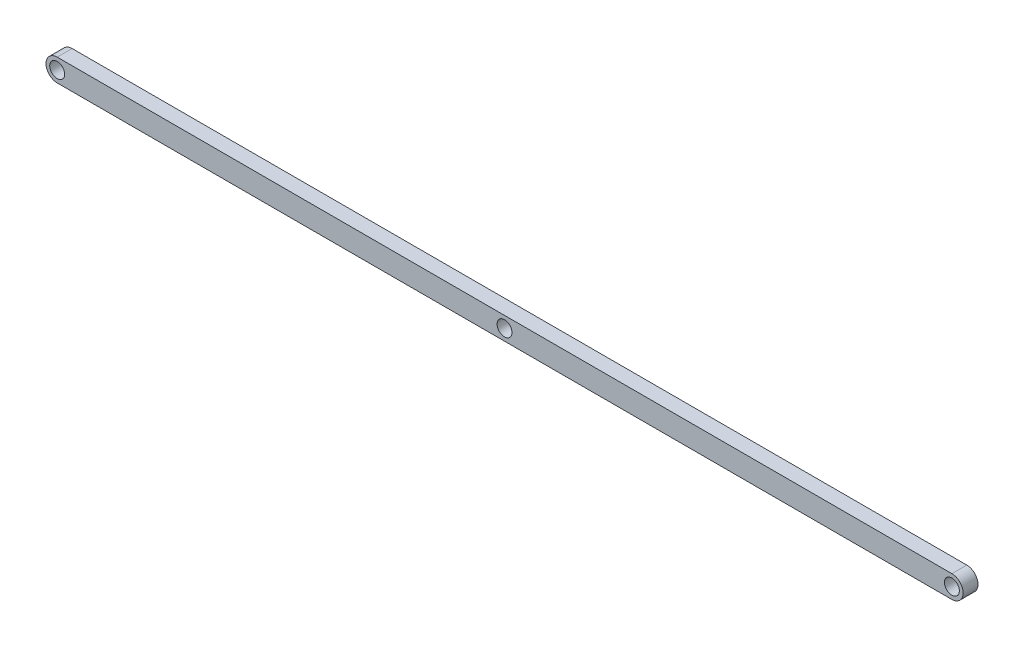
ISO-10303-21;
HEADER;
FILE_DESCRIPTION(('STEP AP214'),'2;1');
FILE_NAME('part.step','',(''),(''),'','','');
FILE_SCHEMA(('AUTOMOTIVE_DESIGN { 1 0 10303 214 1 1 1 1 }'));
ENDSEC;
DATA;
#1=APPLICATION_CONTEXT('core data for automotive mechanical design processes');
#2=APPLICATION_PROTOCOL_DEFINITION('international standard','automotive_design',2000,#1);
#3=PRODUCT_CONTEXT('',#1,'mechanical');
#4=PRODUCT('Part','Part','',(#3));
#5=PRODUCT_RELATED_PRODUCT_CATEGORY('part','',(#4));
#6=PRODUCT_DEFINITION_FORMATION('','',#4);
#7=PRODUCT_DEFINITION_CONTEXT('part definition',#1,'design');
#8=PRODUCT_DEFINITION('design','',#6,#7);
#9=PRODUCT_DEFINITION_SHAPE('','',#8);
#10=(LENGTH_UNIT() NAMED_UNIT(*) SI_UNIT(.MILLI.,.METRE.));
#11=(NAMED_UNIT(*) PLANE_ANGLE_UNIT() SI_UNIT($,.RADIAN.));
#12=(NAMED_UNIT(*) SI_UNIT($,.STERADIAN.) SOLID_ANGLE_UNIT());
#13=UNCERTAINTY_MEASURE_WITH_UNIT(LENGTH_MEASURE(1.E-05),#10,'distance_accuracy_value','');
#14=(GEOMETRIC_REPRESENTATION_CONTEXT(3) GLOBAL_UNCERTAINTY_ASSIGNED_CONTEXT((#13)) GLOBAL_UNIT_ASSIGNED_CONTEXT((#10,
#11,#12)) REPRESENTATION_CONTEXT('',''));
#15=CARTESIAN_POINT('',(0.,0.,0.));
#16=DIRECTION('',(0.,0.,1.));
#17=DIRECTION('',(1.,0.,0.));
#18=AXIS2_PLACEMENT_3D('',#15,#16,#17);
#19=CARTESIAN_POINT('',(0.,1.905,2.54));
#20=DIRECTION('',(0.,1.,0.));
#21=DIRECTION('',(-1.,0.,0.));
#22=AXIS2_PLACEMENT_3D('',#19,#20,#21);
#23=PLANE('',#22);
#24=DIRECTION('',(1.,0.,0.));
#25=VECTOR('',#24,1.);
#26=CARTESIAN_POINT('',(0.,1.905,0.));
#27=LINE('',#26,#25);
#28=CARTESIAN_POINT('',(-76.2,1.905,0.));
#29=VERTEX_POINT('',#28);
#30=CARTESIAN_POINT('',(76.2,1.90500000000001,0.));
#31=VERTEX_POINT('',#30);
#32=EDGE_CURVE('E120',#29,#31,#27,.T.);
#33=ORIENTED_EDGE('',*,*,#32,.F.);
#34=DIRECTION('',(0.,0.,-1.));
#35=VECTOR('',#34,1.);
#36=CARTESIAN_POINT('',(-76.2,1.905,2.54));
#37=LINE('',#36,#35);
#38=CARTESIAN_POINT('',(-76.2,1.905,2.54));
#39=VERTEX_POINT('',#38);
#40=EDGE_CURVE('E11',#39,#29,#37,.T.);
#41=ORIENTED_EDGE('',*,*,#40,.F.);
#42=DIRECTION('',(1.,0.,0.));
#43=VECTOR('',#42,1.);
#44=CARTESIAN_POINT('',(0.,1.905,2.54));
#45=LINE('',#44,#43);
#46=CARTESIAN_POINT('',(76.2,1.90500000000001,2.54));
#47=VERTEX_POINT('',#46);
#48=EDGE_CURVE('E89',#39,#47,#45,.T.);
#49=ORIENTED_EDGE('',*,*,#48,.T.);
#50=DIRECTION('',(0.,0.,-1.));
#51=VECTOR('',#50,1.);
#52=CARTESIAN_POINT('',(76.2,1.90500000000001,2.54));
#53=LINE('',#52,#51);
#54=EDGE_CURVE('E78',#47,#31,#53,.T.);
#55=ORIENTED_EDGE('',*,*,#54,.T.);
#56=EDGE_LOOP('',(#33,#41,#49,#55));
#57=FACE_BOUND('',#56,.T.);
#58=ADVANCED_FACE('F39',(#57),#23,.T.);
#59=CARTESIAN_POINT('',(-76.2,0.,2.54));
#60=DIRECTION('',(0.,0.,-1.));
#61=DIRECTION('',(-1.,0.,0.));
#62=AXIS2_PLACEMENT_3D('',#59,#60,#61);
#63=CYLINDRICAL_SURFACE('',#62,1.90500000000001);
#64=CARTESIAN_POINT('',(-76.2,0.,0.));
#65=DIRECTION('',(0.,0.,1.));
#66=DIRECTION('',(1.,0.,0.));
#67=AXIS2_PLACEMENT_3D('',#64,#65,#66);
#68=CIRCLE('',#67,1.90500000000001);
#69=CARTESIAN_POINT('',(-76.2,-1.905,0.));
#70=VERTEX_POINT('',#69);
#71=EDGE_CURVE('E96',#29,#70,#68,.T.);
#72=ORIENTED_EDGE('',*,*,#71,.T.);
#73=DIRECTION('',(0.,0.,-1.));
#74=VECTOR('',#73,1.);
#75=CARTESIAN_POINT('',(-76.2,-1.905,2.54));
#76=LINE('',#75,#74);
#77=CARTESIAN_POINT('',(-76.2,-1.905,2.54));
#78=VERTEX_POINT('',#77);
#79=EDGE_CURVE('E48',#78,#70,#76,.T.);
#80=ORIENTED_EDGE('',*,*,#79,.F.);
#81=CARTESIAN_POINT('',(-76.2,0.,2.54));
#82=DIRECTION('',(0.,0.,1.));
#83=DIRECTION('',(1.,0.,0.));
#84=AXIS2_PLACEMENT_3D('',#81,#82,#83);
#85=CIRCLE('',#84,1.90500000000001);
#86=EDGE_CURVE('E83',#39,#78,#85,.T.);
#87=ORIENTED_EDGE('',*,*,#86,.F.);
#88=ORIENTED_EDGE('',*,*,#40,.T.);
#89=EDGE_LOOP('',(#72,#80,#87,#88));
#90=FACE_BOUND('',#89,.T.);
#91=ADVANCED_FACE('F94',(#90),#63,.T.);
#92=CARTESIAN_POINT('',(0.,-1.90499999999999,2.54));
#93=DIRECTION('',(0.,-1.,0.));
#94=DIRECTION('',(1.,0.,0.));
#95=AXIS2_PLACEMENT_3D('',#92,#93,#94);
#96=PLANE('',#95);
#97=DIRECTION('',(-1.,0.,0.));
#98=VECTOR('',#97,1.);
#99=CARTESIAN_POINT('',(0.,-1.90499999999999,0.));
#100=LINE('',#99,#98);
#101=CARTESIAN_POINT('',(76.2,-1.90499999999999,0.));
#102=VERTEX_POINT('',#101);
#103=EDGE_CURVE('E126',#102,#70,#100,.T.);
#104=ORIENTED_EDGE('',*,*,#103,.F.);
#105=DIRECTION('',(0.,0.,-1.));
#106=VECTOR('',#105,1.);
#107=CARTESIAN_POINT('',(76.2,-1.90499999999999,2.54));
#108=LINE('',#107,#106);
#109=CARTESIAN_POINT('',(76.2,-1.90499999999999,2.54));
#110=VERTEX_POINT('',#109);
#111=EDGE_CURVE('E71',#110,#102,#108,.T.);
#112=ORIENTED_EDGE('',*,*,#111,.F.);
#113=DIRECTION('',(-1.,0.,0.));
#114=VECTOR('',#113,1.);
#115=CARTESIAN_POINT('',(0.,-1.90499999999999,2.54));
#116=LINE('',#115,#114);
#117=EDGE_CURVE('E88',#110,#78,#116,.T.);
#118=ORIENTED_EDGE('',*,*,#117,.T.);
#119=ORIENTED_EDGE('',*,*,#79,.T.);
#120=EDGE_LOOP('',(#104,#112,#118,#119));
#121=FACE_BOUND('',#120,.T.);
#122=ADVANCED_FACE('F101',(#121),#96,.T.);
#123=CARTESIAN_POINT('',(-76.2,0.,2.54));
#124=DIRECTION('',(0.,0.,-1.));
#125=DIRECTION('',(-1.,0.,0.));
#126=AXIS2_PLACEMENT_3D('',#123,#124,#125);
#127=CYLINDRICAL_SURFACE('',#126,1.26999999999999);
#128=CARTESIAN_POINT('',(-76.2,0.,2.54));
#129=DIRECTION('',(0.,0.,1.));
#130=DIRECTION('',(1.,0.,0.));
#131=AXIS2_PLACEMENT_3D('',#128,#129,#130);
#132=CIRCLE('',#131,1.26999999999999);
#133=CARTESIAN_POINT('',(-74.93,0.,2.54));
#134=VERTEX_POINT('',#133);
#135=EDGE_CURVE('E112',#134,#134,#132,.T.);
#136=ORIENTED_EDGE('',*,*,#135,.T.);
#137=EDGE_LOOP('',(#136));
#138=FACE_BOUND('',#137,.T.);
#139=CARTESIAN_POINT('',(-76.2,0.,0.));
#140=DIRECTION('',(0.,0.,1.));
#141=DIRECTION('',(1.,0.,0.));
#142=AXIS2_PLACEMENT_3D('',#139,#140,#141);
#143=CIRCLE('',#142,1.26999999999999);
#144=CARTESIAN_POINT('',(-74.93,0.,0.));
#145=VERTEX_POINT('',#144);
#146=EDGE_CURVE('E136',#145,#145,#143,.T.);
#147=ORIENTED_EDGE('',*,*,#146,.F.);
#148=EDGE_LOOP('',(#147));
#149=FACE_BOUND('',#148,.T.);
#150=ADVANCED_FACE('F157',(#138,#149),#127,.F.);
#151=CARTESIAN_POINT('',(0.,0.,2.54));
#152=DIRECTION('',(0.,0.,-1.));
#153=DIRECTION('',(-1.,0.,0.));
#154=AXIS2_PLACEMENT_3D('',#151,#152,#153);
#155=CYLINDRICAL_SURFACE('',#154,1.27);
#156=CARTESIAN_POINT('',(0.,0.,2.54));
#157=DIRECTION('',(0.,0.,1.));
#158=DIRECTION('',(1.,0.,0.));
#159=AXIS2_PLACEMENT_3D('',#156,#157,#158);
#160=CIRCLE('',#159,1.27);
#161=CARTESIAN_POINT('',(1.27,0.,2.54));
#162=VERTEX_POINT('',#161);
#163=EDGE_CURVE('E105',#162,#162,#160,.T.);
#164=ORIENTED_EDGE('',*,*,#163,.T.);
#165=EDGE_LOOP('',(#164));
#166=FACE_BOUND('',#165,.T.);
#167=CARTESIAN_POINT('',(0.,0.,0.));
#168=DIRECTION('',(0.,0.,1.));
#169=DIRECTION('',(1.,0.,0.));
#170=AXIS2_PLACEMENT_3D('',#167,#168,#169);
#171=CIRCLE('',#170,1.27);
#172=CARTESIAN_POINT('',(1.27,0.,0.));
#173=VERTEX_POINT('',#172);
#174=EDGE_CURVE('E132',#173,#173,#171,.T.);
#175=ORIENTED_EDGE('',*,*,#174,.F.);
#176=EDGE_LOOP('',(#175));
#177=FACE_BOUND('',#176,.T.);
#178=ADVANCED_FACE('F164',(#166,#177),#155,.F.);
#179=CARTESIAN_POINT('',(76.2,0.,2.54));
#180=DIRECTION('',(0.,0.,-1.));
#181=DIRECTION('',(-1.,0.,0.));
#182=AXIS2_PLACEMENT_3D('',#179,#180,#181);
#183=CYLINDRICAL_SURFACE('',#182,1.90500000000002);
#184=CARTESIAN_POINT('',(76.2,0.,0.));
#185=DIRECTION('',(0.,0.,1.));
#186=DIRECTION('',(1.,0.,0.));
#187=AXIS2_PLACEMENT_3D('',#184,#185,#186);
#188=CIRCLE('',#187,1.90500000000002);
#189=EDGE_CURVE('E129',#102,#31,#188,.T.);
#190=ORIENTED_EDGE('',*,*,#189,.T.);
#191=ORIENTED_EDGE('',*,*,#54,.F.);
#192=CARTESIAN_POINT('',(76.2,0.,2.54));
#193=DIRECTION('',(0.,0.,1.));
#194=DIRECTION('',(1.,0.,0.));
#195=AXIS2_PLACEMENT_3D('',#192,#193,#194);
#196=CIRCLE('',#195,1.90500000000002);
#197=EDGE_CURVE('E56',#110,#47,#196,.T.);
#198=ORIENTED_EDGE('',*,*,#197,.F.);
#199=ORIENTED_EDGE('',*,*,#111,.T.);
#200=EDGE_LOOP('',(#190,#191,#198,#199));
#201=FACE_BOUND('',#200,.T.);
#202=ADVANCED_FACE('F160',(#201),#183,.T.);
#203=CARTESIAN_POINT('',(76.2,0.,2.54));
#204=DIRECTION('',(0.,0.,-1.));
#205=DIRECTION('',(-1.,0.,0.));
#206=AXIS2_PLACEMENT_3D('',#203,#204,#205);
#207=CYLINDRICAL_SURFACE('',#206,1.27000000000001);
#208=CARTESIAN_POINT('',(76.2,0.,2.54));
#209=DIRECTION('',(0.,0.,1.));
#210=DIRECTION('',(1.,0.,0.));
#211=AXIS2_PLACEMENT_3D('',#208,#209,#210);
#212=CIRCLE('',#211,1.27000000000001);
#213=CARTESIAN_POINT('',(77.47,0.,2.54));
#214=VERTEX_POINT('',#213);
#215=EDGE_CURVE('E116',#214,#214,#212,.T.);
#216=ORIENTED_EDGE('',*,*,#215,.T.);
#217=EDGE_LOOP('',(#216));
#218=FACE_BOUND('',#217,.T.);
#219=CARTESIAN_POINT('',(76.2,0.,0.));
#220=DIRECTION('',(0.,0.,1.));
#221=DIRECTION('',(1.,0.,0.));
#222=AXIS2_PLACEMENT_3D('',#219,#220,#221);
#223=CIRCLE('',#222,1.27000000000001);
#224=CARTESIAN_POINT('',(77.47,0.,0.));
#225=VERTEX_POINT('',#224);
#226=EDGE_CURVE('E140',#225,#225,#223,.T.);
#227=ORIENTED_EDGE('',*,*,#226,.F.);
#228=EDGE_LOOP('',(#227));
#229=FACE_BOUND('',#228,.T.);
#230=ADVANCED_FACE('F163',(#218,#229),#207,.F.);
#231=CARTESIAN_POINT('',(0.,0.,2.54));
#232=DIRECTION('',(0.,0.,1.));
#233=DIRECTION('',(1.,0.,0.));
#234=AXIS2_PLACEMENT_3D('',#231,#232,#233);
#235=PLANE('',#234);
#236=ORIENTED_EDGE('',*,*,#48,.F.);
#237=ORIENTED_EDGE('',*,*,#86,.T.);
#238=ORIENTED_EDGE('',*,*,#117,.F.);
#239=ORIENTED_EDGE('',*,*,#197,.T.);
#240=EDGE_LOOP('',(#236,#237,#238,#239));
#241=FACE_BOUND('',#240,.T.);
#242=ORIENTED_EDGE('',*,*,#163,.F.);
#243=EDGE_LOOP('',(#242));
#244=FACE_BOUND('',#243,.T.);
#245=ORIENTED_EDGE('',*,*,#135,.F.);
#246=EDGE_LOOP('',(#245));
#247=FACE_BOUND('',#246,.T.);
#248=ORIENTED_EDGE('',*,*,#215,.F.);
#249=EDGE_LOOP('',(#248));
#250=FACE_BOUND('',#249,.T.);
#251=ADVANCED_FACE('F85',(#241,#244,#247,#250),#235,.T.);
#252=CARTESIAN_POINT('',(0.,0.,0.));
#253=DIRECTION('',(0.,0.,1.));
#254=DIRECTION('',(1.,0.,0.));
#255=AXIS2_PLACEMENT_3D('',#252,#253,#254);
#256=PLANE('',#255);
#257=ORIENTED_EDGE('',*,*,#32,.T.);
#258=ORIENTED_EDGE('',*,*,#189,.F.);
#259=ORIENTED_EDGE('',*,*,#103,.T.);
#260=ORIENTED_EDGE('',*,*,#71,.F.);
#261=EDGE_LOOP('',(#257,#258,#259,#260));
#262=FACE_BOUND('',#261,.T.);
#263=ORIENTED_EDGE('',*,*,#174,.T.);
#264=EDGE_LOOP('',(#263));
#265=FACE_BOUND('',#264,.T.);
#266=ORIENTED_EDGE('',*,*,#146,.T.);
#267=EDGE_LOOP('',(#266));
#268=FACE_BOUND('',#267,.T.);
#269=ORIENTED_EDGE('',*,*,#226,.T.);
#270=EDGE_LOOP('',(#269));
#271=FACE_BOUND('',#270,.T.);
#272=ADVANCED_FACE('F174',(#262,#265,#268,#271),#256,.F.);
#273=CLOSED_SHELL('',(#58,#91,#122,#150,#178,#202,#230,#251,#272));
#274=MANIFOLD_SOLID_BREP('B2',#273);
#275=ADVANCED_BREP_SHAPE_REPRESENTATION('',(#18,#274),#14);
#276=SHAPE_DEFINITION_REPRESENTATION(#9,#275);
ENDSEC;
END-ISO-10303-21;
